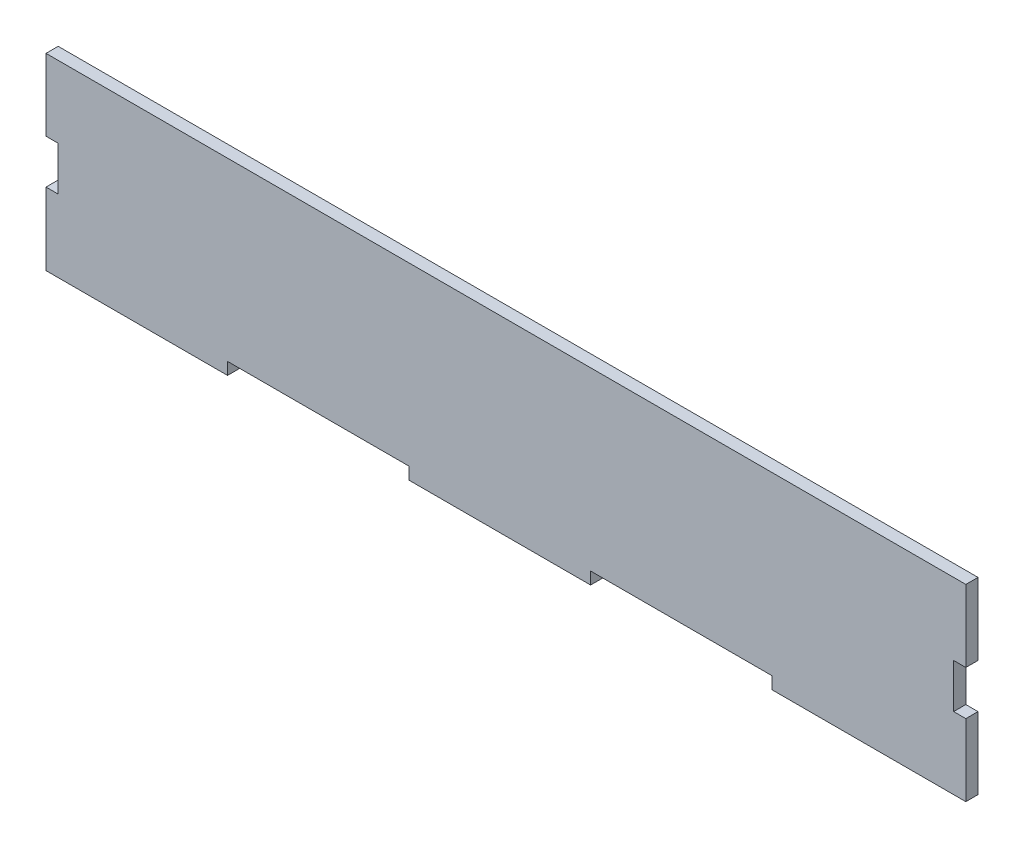
ISO-10303-21;
HEADER;
FILE_DESCRIPTION(('STEP AP214'),'2;1');
FILE_NAME('part.step','',(''),(''),'','','');
FILE_SCHEMA(('AUTOMOTIVE_DESIGN { 1 0 10303 214 1 1 1 1 }'));
ENDSEC;
DATA;
#1=APPLICATION_CONTEXT('core data for automotive mechanical design processes');
#2=APPLICATION_PROTOCOL_DEFINITION('international standard','automotive_design',2000,#1);
#3=PRODUCT_CONTEXT('',#1,'mechanical');
#4=PRODUCT('Part','Part','',(#3));
#5=PRODUCT_RELATED_PRODUCT_CATEGORY('part','',(#4));
#6=PRODUCT_DEFINITION_FORMATION('','',#4);
#7=PRODUCT_DEFINITION_CONTEXT('part definition',#1,'design');
#8=PRODUCT_DEFINITION('design','',#6,#7);
#9=PRODUCT_DEFINITION_SHAPE('','',#8);
#10=(LENGTH_UNIT() NAMED_UNIT(*) SI_UNIT(.MILLI.,.METRE.));
#11=(NAMED_UNIT(*) PLANE_ANGLE_UNIT() SI_UNIT($,.RADIAN.));
#12=(NAMED_UNIT(*) SI_UNIT($,.STERADIAN.) SOLID_ANGLE_UNIT());
#13=UNCERTAINTY_MEASURE_WITH_UNIT(LENGTH_MEASURE(1.E-05),#10,'distance_accuracy_value','');
#14=(GEOMETRIC_REPRESENTATION_CONTEXT(3) GLOBAL_UNCERTAINTY_ASSIGNED_CONTEXT((#13)) GLOBAL_UNIT_ASSIGNED_CONTEXT((#10,
#11,#12)) REPRESENTATION_CONTEXT('',''));
#15=CARTESIAN_POINT('',(0.,0.,0.));
#16=DIRECTION('',(0.,0.,1.));
#17=DIRECTION('',(1.,0.,0.));
#18=AXIS2_PLACEMENT_3D('',#15,#16,#17);
#19=CARTESIAN_POINT('',(-43.0339309113232,-18.4688509372373,5.5));
#20=DIRECTION('',(0.,-1.,0.));
#21=DIRECTION('',(0.,0.,-1.));
#22=AXIS2_PLACEMENT_3D('',#19,#20,#21);
#23=PLANE('',#22);
#24=DIRECTION('',(-1.,0.,0.));
#25=VECTOR('',#24,1.);
#26=CARTESIAN_POINT('',(-43.0339309113232,-18.4688509372373,0.));
#27=LINE('',#26,#25);
#28=CARTESIAN_POINT('',(-43.0339309113232,-18.4688509372373,0.));
#29=VERTEX_POINT('',#28);
#30=CARTESIAN_POINT('',(-48.5339309113232,-18.4688509372373,0.));
#31=VERTEX_POINT('',#30);
#32=EDGE_CURVE('E201',#29,#31,#27,.T.);
#33=ORIENTED_EDGE('',*,*,#32,.T.);
#34=DIRECTION('',(0.,0.,-1.));
#35=VECTOR('',#34,1.);
#36=CARTESIAN_POINT('',(-48.5339309113232,-18.4688509372373,5.5));
#37=LINE('',#36,#35);
#38=CARTESIAN_POINT('',(-48.5339309113232,-18.4688509372373,5.5));
#39=VERTEX_POINT('',#38);
#40=EDGE_CURVE('E11',#39,#31,#37,.T.);
#41=ORIENTED_EDGE('',*,*,#40,.F.);
#42=DIRECTION('',(-1.,0.,0.));
#43=VECTOR('',#42,1.);
#44=CARTESIAN_POINT('',(-43.0339309113232,-18.4688509372373,5.5));
#45=LINE('',#44,#43);
#46=CARTESIAN_POINT('',(-43.0339309113232,-18.4688509372373,5.5));
#47=VERTEX_POINT('',#46);
#48=EDGE_CURVE('E240',#47,#39,#45,.T.);
#49=ORIENTED_EDGE('',*,*,#48,.F.);
#50=DIRECTION('',(0.,0.,-1.));
#51=VECTOR('',#50,1.);
#52=CARTESIAN_POINT('',(-43.0339309113232,-18.4688509372373,5.5));
#53=LINE('',#52,#51);
#54=EDGE_CURVE('E197',#47,#29,#53,.T.);
#55=ORIENTED_EDGE('',*,*,#54,.T.);
#56=EDGE_LOOP('',(#33,#41,#49,#55));
#57=FACE_BOUND('',#56,.T.);
#58=ADVANCED_FACE('F33',(#57),#23,.F.);
#59=CARTESIAN_POINT('',(-48.5339309113232,-18.4688509372373,5.5));
#60=DIRECTION('',(1.,0.,0.));
#61=DIRECTION('',(0.,0.,-1.));
#62=AXIS2_PLACEMENT_3D('',#59,#60,#61);
#63=PLANE('',#62);
#64=DIRECTION('',(0.,-1.,0.));
#65=VECTOR('',#64,1.);
#66=CARTESIAN_POINT('',(-48.5339309113232,-18.4688509372373,0.));
#67=LINE('',#66,#65);
#68=CARTESIAN_POINT('',(-48.5339309113232,-51.1586437729942,0.));
#69=VERTEX_POINT('',#68);
#70=EDGE_CURVE('E204',#31,#69,#67,.T.);
#71=ORIENTED_EDGE('',*,*,#70,.T.);
#72=DIRECTION('',(0.,0.,-1.));
#73=VECTOR('',#72,1.);
#74=CARTESIAN_POINT('',(-48.5339309113232,-51.1586437729942,5.5));
#75=LINE('',#74,#73);
#76=CARTESIAN_POINT('',(-48.5339309113232,-51.1586437729942,5.5));
#77=VERTEX_POINT('',#76);
#78=EDGE_CURVE('E41',#77,#69,#75,.T.);
#79=ORIENTED_EDGE('',*,*,#78,.F.);
#80=DIRECTION('',(0.,-1.,0.));
#81=VECTOR('',#80,1.);
#82=CARTESIAN_POINT('',(-48.5339309113232,-18.4688509372373,5.5));
#83=LINE('',#82,#81);
#84=EDGE_CURVE('E128',#39,#77,#83,.T.);
#85=ORIENTED_EDGE('',*,*,#84,.F.);
#86=ORIENTED_EDGE('',*,*,#40,.T.);
#87=EDGE_LOOP('',(#71,#79,#85,#86));
#88=FACE_BOUND('',#87,.T.);
#89=ADVANCED_FACE('F358',(#88),#63,.F.);
#90=CARTESIAN_POINT('',(-48.5339309113232,-51.1586437729942,5.5));
#91=DIRECTION('',(0.,1.,0.));
#92=DIRECTION('',(0.,0.,1.));
#93=AXIS2_PLACEMENT_3D('',#90,#91,#92);
#94=PLANE('',#93);
#95=DIRECTION('',(1.,0.,0.));
#96=VECTOR('',#95,1.);
#97=CARTESIAN_POINT('',(-48.5339309113232,-51.1586437729942,0.));
#98=LINE('',#97,#96);
#99=CARTESIAN_POINT('',(33.4660690886768,-51.1586437729942,0.));
#100=VERTEX_POINT('',#99);
#101=EDGE_CURVE('E206',#69,#100,#98,.T.);
#102=ORIENTED_EDGE('',*,*,#101,.T.);
#103=DIRECTION('',(0.,0.,-1.));
#104=VECTOR('',#103,1.);
#105=CARTESIAN_POINT('',(33.4660690886768,-51.1586437729942,5.5));
#106=LINE('',#105,#104);
#107=CARTESIAN_POINT('',(33.4660690886768,-51.1586437729942,5.5));
#108=VERTEX_POINT('',#107);
#109=EDGE_CURVE('E283',#108,#100,#106,.T.);
#110=ORIENTED_EDGE('',*,*,#109,.F.);
#111=DIRECTION('',(1.,0.,0.));
#112=VECTOR('',#111,1.);
#113=CARTESIAN_POINT('',(-48.5339309113232,-51.1586437729942,5.5));
#114=LINE('',#113,#112);
#115=EDGE_CURVE('E291',#77,#108,#114,.T.);
#116=ORIENTED_EDGE('',*,*,#115,.F.);
#117=ORIENTED_EDGE('',*,*,#78,.T.);
#118=EDGE_LOOP('',(#102,#110,#116,#117));
#119=FACE_BOUND('',#118,.T.);
#120=ADVANCED_FACE('F289',(#119),#94,.F.);
#121=CARTESIAN_POINT('',(33.4660690886768,-51.1586437729942,5.5));
#122=DIRECTION('',(-1.,0.,0.));
#123=DIRECTION('',(0.,0.,1.));
#124=AXIS2_PLACEMENT_3D('',#121,#122,#123);
#125=PLANE('',#124);
#126=DIRECTION('',(0.,1.,0.));
#127=VECTOR('',#126,1.);
#128=CARTESIAN_POINT('',(33.4660690886768,-51.1586437729942,0.));
#129=LINE('',#128,#127);
#130=CARTESIAN_POINT('',(33.4660690886768,-45.6586437729942,0.));
#131=VERTEX_POINT('',#130);
#132=EDGE_CURVE('E208',#100,#131,#129,.T.);
#133=ORIENTED_EDGE('',*,*,#132,.T.);
#134=DIRECTION('',(0.,0.,-1.));
#135=VECTOR('',#134,1.);
#136=CARTESIAN_POINT('',(33.4660690886768,-45.6586437729942,5.5));
#137=LINE('',#136,#135);
#138=CARTESIAN_POINT('',(33.4660690886768,-45.6586437729942,5.5));
#139=VERTEX_POINT('',#138);
#140=EDGE_CURVE('E280',#139,#131,#137,.T.);
#141=ORIENTED_EDGE('',*,*,#140,.F.);
#142=DIRECTION('',(0.,1.,0.));
#143=VECTOR('',#142,1.);
#144=CARTESIAN_POINT('',(33.4660690886768,-51.1586437729942,5.5));
#145=LINE('',#144,#143);
#146=EDGE_CURVE('E309',#108,#139,#145,.T.);
#147=ORIENTED_EDGE('',*,*,#146,.F.);
#148=ORIENTED_EDGE('',*,*,#109,.T.);
#149=EDGE_LOOP('',(#133,#141,#147,#148));
#150=FACE_BOUND('',#149,.T.);
#151=ADVANCED_FACE('F300',(#150),#125,.F.);
#152=CARTESIAN_POINT('',(33.4660690886768,-45.6586437729942,5.5));
#153=DIRECTION('',(0.,1.,0.));
#154=DIRECTION('',(0.,0.,1.));
#155=AXIS2_PLACEMENT_3D('',#152,#153,#154);
#156=PLANE('',#155);
#157=DIRECTION('',(1.,0.,0.));
#158=VECTOR('',#157,1.);
#159=CARTESIAN_POINT('',(33.4660690886768,-45.6586437729942,0.));
#160=LINE('',#159,#158);
#161=CARTESIAN_POINT('',(115.466069088677,-45.6586437729942,0.));
#162=VERTEX_POINT('',#161);
#163=EDGE_CURVE('E210',#131,#162,#160,.T.);
#164=ORIENTED_EDGE('',*,*,#163,.T.);
#165=DIRECTION('',(0.,0.,-1.));
#166=VECTOR('',#165,1.);
#167=CARTESIAN_POINT('',(115.466069088677,-45.6586437729942,5.5));
#168=LINE('',#167,#166);
#169=CARTESIAN_POINT('',(115.466069088677,-45.6586437729942,5.5));
#170=VERTEX_POINT('',#169);
#171=EDGE_CURVE('E277',#170,#162,#168,.T.);
#172=ORIENTED_EDGE('',*,*,#171,.F.);
#173=DIRECTION('',(1.,0.,0.));
#174=VECTOR('',#173,1.);
#175=CARTESIAN_POINT('',(33.4660690886768,-45.6586437729942,5.5));
#176=LINE('',#175,#174);
#177=EDGE_CURVE('E306',#139,#170,#176,.T.);
#178=ORIENTED_EDGE('',*,*,#177,.F.);
#179=ORIENTED_EDGE('',*,*,#140,.T.);
#180=EDGE_LOOP('',(#164,#172,#178,#179));
#181=FACE_BOUND('',#180,.T.);
#182=ADVANCED_FACE('F304',(#181),#156,.F.);
#183=CARTESIAN_POINT('',(115.466069088677,-45.6586437729942,5.5));
#184=DIRECTION('',(1.,0.,0.));
#185=DIRECTION('',(0.,0.,-1.));
#186=AXIS2_PLACEMENT_3D('',#183,#184,#185);
#187=PLANE('',#186);
#188=DIRECTION('',(0.,-1.,0.));
#189=VECTOR('',#188,1.);
#190=CARTESIAN_POINT('',(115.466069088677,-45.6586437729942,0.));
#191=LINE('',#190,#189);
#192=CARTESIAN_POINT('',(115.466069088677,-51.1586437729942,0.));
#193=VERTEX_POINT('',#192);
#194=EDGE_CURVE('E212',#162,#193,#191,.T.);
#195=ORIENTED_EDGE('',*,*,#194,.T.);
#196=DIRECTION('',(0.,0.,-1.));
#197=VECTOR('',#196,1.);
#198=CARTESIAN_POINT('',(115.466069088677,-51.1586437729942,5.5));
#199=LINE('',#198,#197);
#200=CARTESIAN_POINT('',(115.466069088677,-51.1586437729942,5.5));
#201=VERTEX_POINT('',#200);
#202=EDGE_CURVE('E274',#201,#193,#199,.T.);
#203=ORIENTED_EDGE('',*,*,#202,.F.);
#204=DIRECTION('',(0.,-1.,0.));
#205=VECTOR('',#204,1.);
#206=CARTESIAN_POINT('',(115.466069088677,-45.6586437729942,5.5));
#207=LINE('',#206,#205);
#208=EDGE_CURVE('E308',#170,#201,#207,.T.);
#209=ORIENTED_EDGE('',*,*,#208,.F.);
#210=ORIENTED_EDGE('',*,*,#171,.T.);
#211=EDGE_LOOP('',(#195,#203,#209,#210));
#212=FACE_BOUND('',#211,.T.);
#213=ADVANCED_FACE('F371',(#212),#187,.F.);
#214=CARTESIAN_POINT('',(115.466069088677,-51.1586437729942,5.5));
#215=DIRECTION('',(0.,1.,0.));
#216=DIRECTION('',(0.,0.,1.));
#217=AXIS2_PLACEMENT_3D('',#214,#215,#216);
#218=PLANE('',#217);
#219=DIRECTION('',(1.,0.,0.));
#220=VECTOR('',#219,1.);
#221=CARTESIAN_POINT('',(115.466069088677,-51.1586437729942,0.));
#222=LINE('',#221,#220);
#223=CARTESIAN_POINT('',(197.466069088677,-51.1586437729942,0.));
#224=VERTEX_POINT('',#223);
#225=EDGE_CURVE('E214',#193,#224,#222,.T.);
#226=ORIENTED_EDGE('',*,*,#225,.T.);
#227=DIRECTION('',(0.,0.,-1.));
#228=VECTOR('',#227,1.);
#229=CARTESIAN_POINT('',(197.466069088677,-51.1586437729942,5.5));
#230=LINE('',#229,#228);
#231=CARTESIAN_POINT('',(197.466069088677,-51.1586437729942,5.5));
#232=VERTEX_POINT('',#231);
#233=EDGE_CURVE('E271',#232,#224,#230,.T.);
#234=ORIENTED_EDGE('',*,*,#233,.F.);
#235=DIRECTION('',(1.,0.,0.));
#236=VECTOR('',#235,1.);
#237=CARTESIAN_POINT('',(115.466069088677,-51.1586437729942,5.5));
#238=LINE('',#237,#236);
#239=EDGE_CURVE('E311',#201,#232,#238,.T.);
#240=ORIENTED_EDGE('',*,*,#239,.F.);
#241=ORIENTED_EDGE('',*,*,#202,.T.);
#242=EDGE_LOOP('',(#226,#234,#240,#241));
#243=FACE_BOUND('',#242,.T.);
#244=ADVANCED_FACE('F374',(#243),#218,.F.);
#245=CARTESIAN_POINT('',(197.466069088677,-51.1586437729942,5.5));
#246=DIRECTION('',(-1.,0.,0.));
#247=DIRECTION('',(0.,0.,1.));
#248=AXIS2_PLACEMENT_3D('',#245,#246,#247);
#249=PLANE('',#248);
#250=DIRECTION('',(0.,1.,0.));
#251=VECTOR('',#250,1.);
#252=CARTESIAN_POINT('',(197.466069088677,-51.1586437729942,0.));
#253=LINE('',#252,#251);
#254=CARTESIAN_POINT('',(197.466069088677,-45.6586437729942,0.));
#255=VERTEX_POINT('',#254);
#256=EDGE_CURVE('E216',#224,#255,#253,.T.);
#257=ORIENTED_EDGE('',*,*,#256,.T.);
#258=DIRECTION('',(0.,0.,-1.));
#259=VECTOR('',#258,1.);
#260=CARTESIAN_POINT('',(197.466069088677,-45.6586437729942,5.5));
#261=LINE('',#260,#259);
#262=CARTESIAN_POINT('',(197.466069088677,-45.6586437729942,5.5));
#263=VERTEX_POINT('',#262);
#264=EDGE_CURVE('E268',#263,#255,#261,.T.);
#265=ORIENTED_EDGE('',*,*,#264,.F.);
#266=DIRECTION('',(0.,1.,0.));
#267=VECTOR('',#266,1.);
#268=CARTESIAN_POINT('',(197.466069088677,-51.1586437729942,5.5));
#269=LINE('',#268,#267);
#270=EDGE_CURVE('E317',#232,#263,#269,.T.);
#271=ORIENTED_EDGE('',*,*,#270,.F.);
#272=ORIENTED_EDGE('',*,*,#233,.T.);
#273=EDGE_LOOP('',(#257,#265,#271,#272));
#274=FACE_BOUND('',#273,.T.);
#275=ADVANCED_FACE('F378',(#274),#249,.F.);
#276=CARTESIAN_POINT('',(197.466069088677,-45.6586437729942,5.5));
#277=DIRECTION('',(0.,1.,0.));
#278=DIRECTION('',(0.,0.,1.));
#279=AXIS2_PLACEMENT_3D('',#276,#277,#278);
#280=PLANE('',#279);
#281=DIRECTION('',(1.,0.,0.));
#282=VECTOR('',#281,1.);
#283=CARTESIAN_POINT('',(197.466069088677,-45.6586437729942,0.));
#284=LINE('',#283,#282);
#285=CARTESIAN_POINT('',(279.466069088677,-45.6586437729942,0.));
#286=VERTEX_POINT('',#285);
#287=EDGE_CURVE('E218',#255,#286,#284,.T.);
#288=ORIENTED_EDGE('',*,*,#287,.T.);
#289=DIRECTION('',(0.,0.,-1.));
#290=VECTOR('',#289,1.);
#291=CARTESIAN_POINT('',(279.466069088677,-45.6586437729942,5.5));
#292=LINE('',#291,#290);
#293=CARTESIAN_POINT('',(279.466069088677,-45.6586437729942,5.5));
#294=VERTEX_POINT('',#293);
#295=EDGE_CURVE('E265',#294,#286,#292,.T.);
#296=ORIENTED_EDGE('',*,*,#295,.F.);
#297=DIRECTION('',(1.,0.,0.));
#298=VECTOR('',#297,1.);
#299=CARTESIAN_POINT('',(197.466069088677,-45.6586437729942,5.5));
#300=LINE('',#299,#298);
#301=EDGE_CURVE('E319',#263,#294,#300,.T.);
#302=ORIENTED_EDGE('',*,*,#301,.F.);
#303=ORIENTED_EDGE('',*,*,#264,.T.);
#304=EDGE_LOOP('',(#288,#296,#302,#303));
#305=FACE_BOUND('',#304,.T.);
#306=ADVANCED_FACE('F382',(#305),#280,.F.);
#307=CARTESIAN_POINT('',(279.466069088677,-45.6586437729942,5.5));
#308=DIRECTION('',(1.,0.,0.));
#309=DIRECTION('',(0.,0.,-1.));
#310=AXIS2_PLACEMENT_3D('',#307,#308,#309);
#311=PLANE('',#310);
#312=DIRECTION('',(0.,-1.,0.));
#313=VECTOR('',#312,1.);
#314=CARTESIAN_POINT('',(279.466069088677,-45.6586437729942,0.));
#315=LINE('',#314,#313);
#316=CARTESIAN_POINT('',(279.466069088677,-51.1586437729942,0.));
#317=VERTEX_POINT('',#316);
#318=EDGE_CURVE('E220',#286,#317,#315,.T.);
#319=ORIENTED_EDGE('',*,*,#318,.T.);
#320=DIRECTION('',(0.,0.,-1.));
#321=VECTOR('',#320,1.);
#322=CARTESIAN_POINT('',(279.466069088677,-51.1586437729942,5.5));
#323=LINE('',#322,#321);
#324=CARTESIAN_POINT('',(279.466069088677,-51.1586437729942,5.5));
#325=VERTEX_POINT('',#324);
#326=EDGE_CURVE('E262',#325,#317,#323,.T.);
#327=ORIENTED_EDGE('',*,*,#326,.F.);
#328=DIRECTION('',(0.,-1.,0.));
#329=VECTOR('',#328,1.);
#330=CARTESIAN_POINT('',(279.466069088677,-45.6586437729942,5.5));
#331=LINE('',#330,#329);
#332=EDGE_CURVE('E321',#294,#325,#331,.T.);
#333=ORIENTED_EDGE('',*,*,#332,.F.);
#334=ORIENTED_EDGE('',*,*,#295,.T.);
#335=EDGE_LOOP('',(#319,#327,#333,#334));
#336=FACE_BOUND('',#335,.T.);
#337=ADVANCED_FACE('F386',(#336),#311,.F.);
#338=CARTESIAN_POINT('',(279.466069088677,-51.1586437729942,5.5));
#339=DIRECTION('',(0.,1.,0.));
#340=DIRECTION('',(0.,0.,1.));
#341=AXIS2_PLACEMENT_3D('',#338,#339,#340);
#342=PLANE('',#341);
#343=DIRECTION('',(1.,0.,0.));
#344=VECTOR('',#343,1.);
#345=CARTESIAN_POINT('',(279.466069088677,-51.1586437729942,0.));
#346=LINE('',#345,#344);
#347=CARTESIAN_POINT('',(366.966069088677,-51.1586437729942,0.));
#348=VERTEX_POINT('',#347);
#349=EDGE_CURVE('E222',#317,#348,#346,.T.);
#350=ORIENTED_EDGE('',*,*,#349,.T.);
#351=DIRECTION('',(0.,0.,-1.));
#352=VECTOR('',#351,1.);
#353=CARTESIAN_POINT('',(366.966069088677,-51.1586437729942,5.5));
#354=LINE('',#353,#352);
#355=CARTESIAN_POINT('',(366.966069088677,-51.1586437729942,5.5));
#356=VERTEX_POINT('',#355);
#357=EDGE_CURVE('E259',#356,#348,#354,.T.);
#358=ORIENTED_EDGE('',*,*,#357,.F.);
#359=DIRECTION('',(1.,0.,0.));
#360=VECTOR('',#359,1.);
#361=CARTESIAN_POINT('',(279.466069088677,-51.1586437729942,5.5));
#362=LINE('',#361,#360);
#363=EDGE_CURVE('E323',#325,#356,#362,.T.);
#364=ORIENTED_EDGE('',*,*,#363,.F.);
#365=ORIENTED_EDGE('',*,*,#326,.T.);
#366=EDGE_LOOP('',(#350,#358,#364,#365));
#367=FACE_BOUND('',#366,.T.);
#368=ADVANCED_FACE('F390',(#367),#342,.F.);
#369=CARTESIAN_POINT('',(366.966069088677,-18.6586437729942,5.5));
#370=DIRECTION('',(-1.,0.,0.));
#371=DIRECTION('',(0.,0.,1.));
#372=AXIS2_PLACEMENT_3D('',#369,#370,#371);
#373=PLANE('',#372);
#374=DIRECTION('',(0.,1.,0.));
#375=VECTOR('',#374,1.);
#376=CARTESIAN_POINT('',(366.966069088677,-18.6586437729942,0.));
#377=LINE('',#376,#375);
#378=CARTESIAN_POINT('',(366.966069088677,-18.6586437729942,0.));
#379=VERTEX_POINT('',#378);
#380=EDGE_CURVE('E224',#348,#379,#377,.T.);
#381=ORIENTED_EDGE('',*,*,#380,.T.);
#382=DIRECTION('',(0.,0.,-1.));
#383=VECTOR('',#382,1.);
#384=CARTESIAN_POINT('',(366.966069088677,-18.6586437729942,5.5));
#385=LINE('',#384,#383);
#386=CARTESIAN_POINT('',(366.966069088677,-18.6586437729942,5.5));
#387=VERTEX_POINT('',#386);
#388=EDGE_CURVE('E256',#387,#379,#385,.T.);
#389=ORIENTED_EDGE('',*,*,#388,.F.);
#390=DIRECTION('',(0.,1.,0.));
#391=VECTOR('',#390,1.);
#392=CARTESIAN_POINT('',(366.966069088677,-18.6586437729942,5.5));
#393=LINE('',#392,#391);
#394=EDGE_CURVE('E325',#356,#387,#393,.T.);
#395=ORIENTED_EDGE('',*,*,#394,.F.);
#396=ORIENTED_EDGE('',*,*,#357,.T.);
#397=EDGE_LOOP('',(#381,#389,#395,#396));
#398=FACE_BOUND('',#397,.T.);
#399=ADVANCED_FACE('F394',(#398),#373,.F.);
#400=CARTESIAN_POINT('',(366.966069088677,-18.6586437729942,5.5));
#401=DIRECTION('',(0.,-1.,0.));
#402=DIRECTION('',(1.,0.,0.));
#403=AXIS2_PLACEMENT_3D('',#400,#401,#402);
#404=PLANE('',#403);
#405=DIRECTION('',(-1.,0.,0.));
#406=VECTOR('',#405,1.);
#407=CARTESIAN_POINT('',(366.966069088677,-18.6586437729942,0.));
#408=LINE('',#407,#406);
#409=CARTESIAN_POINT('',(361.466069088677,-18.6586437729942,0.));
#410=VERTEX_POINT('',#409);
#411=EDGE_CURVE('E226',#379,#410,#408,.T.);
#412=ORIENTED_EDGE('',*,*,#411,.T.);
#413=DIRECTION('',(0.,0.,-1.));
#414=VECTOR('',#413,1.);
#415=CARTESIAN_POINT('',(361.466069088677,-18.6586437729942,5.5));
#416=LINE('',#415,#414);
#417=CARTESIAN_POINT('',(361.466069088677,-18.6586437729942,5.5));
#418=VERTEX_POINT('',#417);
#419=EDGE_CURVE('E253',#418,#410,#416,.T.);
#420=ORIENTED_EDGE('',*,*,#419,.F.);
#421=DIRECTION('',(-1.,0.,0.));
#422=VECTOR('',#421,1.);
#423=CARTESIAN_POINT('',(366.966069088677,-18.6586437729942,5.5));
#424=LINE('',#423,#422);
#425=EDGE_CURVE('E327',#387,#418,#424,.T.);
#426=ORIENTED_EDGE('',*,*,#425,.F.);
#427=ORIENTED_EDGE('',*,*,#388,.T.);
#428=EDGE_LOOP('',(#412,#420,#426,#427));
#429=FACE_BOUND('',#428,.T.);
#430=ADVANCED_FACE('F398',(#429),#404,.F.);
#431=CARTESIAN_POINT('',(361.466069088677,-8.65864377299418,5.5));
#432=DIRECTION('',(-1.,0.,0.));
#433=DIRECTION('',(0.,0.,1.));
#434=AXIS2_PLACEMENT_3D('',#431,#432,#433);
#435=PLANE('',#434);
#436=DIRECTION('',(0.,1.,0.));
#437=VECTOR('',#436,1.);
#438=CARTESIAN_POINT('',(361.466069088677,-8.65864377299418,0.));
#439=LINE('',#438,#437);
#440=CARTESIAN_POINT('',(361.466069088677,1.34135622700582,0.));
#441=VERTEX_POINT('',#440);
#442=EDGE_CURVE('E229',#410,#441,#439,.T.);
#443=ORIENTED_EDGE('',*,*,#442,.T.);
#444=DIRECTION('',(0.,0.,-1.));
#445=VECTOR('',#444,1.);
#446=CARTESIAN_POINT('',(361.466069088677,1.34135622700582,5.5));
#447=LINE('',#446,#445);
#448=CARTESIAN_POINT('',(361.466069088677,1.34135622700582,5.5));
#449=VERTEX_POINT('',#448);
#450=EDGE_CURVE('E250',#449,#441,#447,.T.);
#451=ORIENTED_EDGE('',*,*,#450,.F.);
#452=DIRECTION('',(0.,1.,0.));
#453=VECTOR('',#452,1.);
#454=CARTESIAN_POINT('',(361.466069088677,-18.6586437729942,5.5));
#455=LINE('',#454,#453);
#456=EDGE_CURVE('E329',#418,#449,#455,.T.);
#457=ORIENTED_EDGE('',*,*,#456,.F.);
#458=ORIENTED_EDGE('',*,*,#419,.T.);
#459=EDGE_LOOP('',(#443,#451,#457,#458));
#460=FACE_BOUND('',#459,.T.);
#461=ADVANCED_FACE('F402',(#460),#435,.F.);
#462=CARTESIAN_POINT('',(361.466069088677,1.34135622700582,5.5));
#463=DIRECTION('',(0.,1.,0.));
#464=DIRECTION('',(0.,0.,1.));
#465=AXIS2_PLACEMENT_3D('',#462,#463,#464);
#466=PLANE('',#465);
#467=DIRECTION('',(1.,0.,0.));
#468=VECTOR('',#467,1.);
#469=CARTESIAN_POINT('',(361.466069088677,1.34135622700582,0.));
#470=LINE('',#469,#468);
#471=CARTESIAN_POINT('',(366.966069088677,1.34135622700582,0.));
#472=VERTEX_POINT('',#471);
#473=EDGE_CURVE('E231',#441,#472,#470,.T.);
#474=ORIENTED_EDGE('',*,*,#473,.T.);
#475=DIRECTION('',(0.,0.,-1.));
#476=VECTOR('',#475,1.);
#477=CARTESIAN_POINT('',(366.966069088677,1.34135622700582,5.5));
#478=LINE('',#477,#476);
#479=CARTESIAN_POINT('',(366.966069088677,1.34135622700582,5.5));
#480=VERTEX_POINT('',#479);
#481=EDGE_CURVE('E247',#480,#472,#478,.T.);
#482=ORIENTED_EDGE('',*,*,#481,.F.);
#483=DIRECTION('',(1.,0.,0.));
#484=VECTOR('',#483,1.);
#485=CARTESIAN_POINT('',(361.466069088677,1.34135622700582,5.5));
#486=LINE('',#485,#484);
#487=EDGE_CURVE('E331',#449,#480,#486,.T.);
#488=ORIENTED_EDGE('',*,*,#487,.F.);
#489=ORIENTED_EDGE('',*,*,#450,.T.);
#490=EDGE_LOOP('',(#474,#482,#488,#489));
#491=FACE_BOUND('',#490,.T.);
#492=ADVANCED_FACE('F406',(#491),#466,.F.);
#493=CARTESIAN_POINT('',(366.966069088677,33.8413562270058,5.5));
#494=DIRECTION('',(-1.,0.,0.));
#495=DIRECTION('',(0.,0.,1.));
#496=AXIS2_PLACEMENT_3D('',#493,#494,#495);
#497=PLANE('',#496);
#498=DIRECTION('',(0.,1.,0.));
#499=VECTOR('',#498,1.);
#500=CARTESIAN_POINT('',(366.966069088677,33.8413562270058,0.));
#501=LINE('',#500,#499);
#502=CARTESIAN_POINT('',(366.966069088677,33.8413562270058,0.));
#503=VERTEX_POINT('',#502);
#504=EDGE_CURVE('E233',#472,#503,#501,.T.);
#505=ORIENTED_EDGE('',*,*,#504,.T.);
#506=DIRECTION('',(0.,0.,-1.));
#507=VECTOR('',#506,1.);
#508=CARTESIAN_POINT('',(366.966069088677,33.8413562270058,5.5));
#509=LINE('',#508,#507);
#510=CARTESIAN_POINT('',(366.966069088677,33.8413562270058,5.5));
#511=VERTEX_POINT('',#510);
#512=EDGE_CURVE('E244',#511,#503,#509,.T.);
#513=ORIENTED_EDGE('',*,*,#512,.F.);
#514=DIRECTION('',(0.,1.,0.));
#515=VECTOR('',#514,1.);
#516=CARTESIAN_POINT('',(366.966069088677,33.8413562270058,5.5));
#517=LINE('',#516,#515);
#518=EDGE_CURVE('E333',#480,#511,#517,.T.);
#519=ORIENTED_EDGE('',*,*,#518,.F.);
#520=ORIENTED_EDGE('',*,*,#481,.T.);
#521=EDGE_LOOP('',(#505,#513,#519,#520));
#522=FACE_BOUND('',#521,.T.);
#523=ADVANCED_FACE('F339',(#522),#497,.F.);
#524=CARTESIAN_POINT('',(-48.5339309113232,33.8413562270058,5.5));
#525=DIRECTION('',(0.,-1.,0.));
#526=DIRECTION('',(0.,0.,-1.));
#527=AXIS2_PLACEMENT_3D('',#524,#525,#526);
#528=PLANE('',#527);
#529=DIRECTION('',(-1.,0.,0.));
#530=VECTOR('',#529,1.);
#531=CARTESIAN_POINT('',(-48.5339309113232,33.8413562270058,0.));
#532=LINE('',#531,#530);
#533=CARTESIAN_POINT('',(-48.5339309113232,33.8413562270058,0.));
#534=VERTEX_POINT('',#533);
#535=EDGE_CURVE('E235',#503,#534,#532,.T.);
#536=ORIENTED_EDGE('',*,*,#535,.T.);
#537=DIRECTION('',(0.,0.,-1.));
#538=VECTOR('',#537,1.);
#539=CARTESIAN_POINT('',(-48.5339309113232,33.8413562270058,5.5));
#540=LINE('',#539,#538);
#541=CARTESIAN_POINT('',(-48.5339309113232,33.8413562270058,5.5));
#542=VERTEX_POINT('',#541);
#543=EDGE_CURVE('E192',#542,#534,#540,.T.);
#544=ORIENTED_EDGE('',*,*,#543,.F.);
#545=DIRECTION('',(-1.,0.,0.));
#546=VECTOR('',#545,1.);
#547=CARTESIAN_POINT('',(-48.5339309113232,33.8413562270058,5.5));
#548=LINE('',#547,#546);
#549=EDGE_CURVE('E183',#511,#542,#548,.T.);
#550=ORIENTED_EDGE('',*,*,#549,.F.);
#551=ORIENTED_EDGE('',*,*,#512,.T.);
#552=EDGE_LOOP('',(#536,#544,#550,#551));
#553=FACE_BOUND('',#552,.T.);
#554=ADVANCED_FACE('F343',(#553),#528,.F.);
#555=CARTESIAN_POINT('',(-48.5339309113232,1.42047220165704,5.5));
#556=DIRECTION('',(1.,0.,0.));
#557=DIRECTION('',(0.,0.,-1.));
#558=AXIS2_PLACEMENT_3D('',#555,#556,#557);
#559=PLANE('',#558);
#560=DIRECTION('',(0.,-1.,0.));
#561=VECTOR('',#560,1.);
#562=CARTESIAN_POINT('',(-48.5339309113232,1.42047220165704,0.));
#563=LINE('',#562,#561);
#564=CARTESIAN_POINT('',(-48.5339309113232,1.42047220165704,0.));
#565=VERTEX_POINT('',#564);
#566=EDGE_CURVE('E191',#534,#565,#563,.T.);
#567=ORIENTED_EDGE('',*,*,#566,.T.);
#568=DIRECTION('',(0.,0.,-1.));
#569=VECTOR('',#568,1.);
#570=CARTESIAN_POINT('',(-48.5339309113232,1.42047220165704,5.5));
#571=LINE('',#570,#569);
#572=CARTESIAN_POINT('',(-48.5339309113232,1.42047220165704,5.5));
#573=VERTEX_POINT('',#572);
#574=EDGE_CURVE('E188',#573,#565,#571,.T.);
#575=ORIENTED_EDGE('',*,*,#574,.F.);
#576=DIRECTION('',(0.,-1.,0.));
#577=VECTOR('',#576,1.);
#578=CARTESIAN_POINT('',(-48.5339309113232,1.42047220165704,5.5));
#579=LINE('',#578,#577);
#580=EDGE_CURVE('E177',#542,#573,#579,.T.);
#581=ORIENTED_EDGE('',*,*,#580,.F.);
#582=ORIENTED_EDGE('',*,*,#543,.T.);
#583=EDGE_LOOP('',(#567,#575,#581,#582));
#584=FACE_BOUND('',#583,.T.);
#585=ADVANCED_FACE('F189',(#584),#559,.F.);
#586=CARTESIAN_POINT('',(-48.5339309113232,1.42047220165704,5.5));
#587=DIRECTION('',(0.,1.,0.));
#588=DIRECTION('',(0.,0.,1.));
#589=AXIS2_PLACEMENT_3D('',#586,#587,#588);
#590=PLANE('',#589);
#591=DIRECTION('',(1.,0.,0.));
#592=VECTOR('',#591,1.);
#593=CARTESIAN_POINT('',(-48.5339309113232,1.42047220165704,0.));
#594=LINE('',#593,#592);
#595=CARTESIAN_POINT('',(-43.0339309113232,1.42047220165704,0.));
#596=VERTEX_POINT('',#595);
#597=EDGE_CURVE('E114',#565,#596,#594,.T.);
#598=ORIENTED_EDGE('',*,*,#597,.T.);
#599=DIRECTION('',(0.,0.,-1.));
#600=VECTOR('',#599,1.);
#601=CARTESIAN_POINT('',(-43.0339309113232,1.42047220165704,5.5));
#602=LINE('',#601,#600);
#603=CARTESIAN_POINT('',(-43.0339309113232,1.42047220165704,5.5));
#604=VERTEX_POINT('',#603);
#605=EDGE_CURVE('E193',#604,#596,#602,.T.);
#606=ORIENTED_EDGE('',*,*,#605,.F.);
#607=DIRECTION('',(1.,0.,0.));
#608=VECTOR('',#607,1.);
#609=CARTESIAN_POINT('',(-48.5339309113232,1.42047220165704,5.5));
#610=LINE('',#609,#608);
#611=EDGE_CURVE('E181',#573,#604,#610,.T.);
#612=ORIENTED_EDGE('',*,*,#611,.F.);
#613=ORIENTED_EDGE('',*,*,#574,.T.);
#614=EDGE_LOOP('',(#598,#606,#612,#613));
#615=FACE_BOUND('',#614,.T.);
#616=ADVANCED_FACE('F195',(#615),#590,.F.);
#617=CARTESIAN_POINT('',(-43.0339309113232,1.42047220165704,5.5));
#618=DIRECTION('',(1.,0.,0.));
#619=DIRECTION('',(0.,0.,-1.));
#620=AXIS2_PLACEMENT_3D('',#617,#618,#619);
#621=PLANE('',#620);
#622=DIRECTION('',(0.,-1.,0.));
#623=VECTOR('',#622,1.);
#624=CARTESIAN_POINT('',(-43.0339309113232,1.42047220165704,0.));
#625=LINE('',#624,#623);
#626=EDGE_CURVE('E120',#596,#29,#625,.T.);
#627=ORIENTED_EDGE('',*,*,#626,.T.);
#628=ORIENTED_EDGE('',*,*,#54,.F.);
#629=DIRECTION('',(0.,-1.,0.));
#630=VECTOR('',#629,1.);
#631=CARTESIAN_POINT('',(-43.0339309113232,1.42047220165704,5.5));
#632=LINE('',#631,#630);
#633=EDGE_CURVE('E49',#604,#47,#632,.T.);
#634=ORIENTED_EDGE('',*,*,#633,.F.);
#635=ORIENTED_EDGE('',*,*,#605,.T.);
#636=EDGE_LOOP('',(#627,#628,#634,#635));
#637=FACE_BOUND('',#636,.T.);
#638=ADVANCED_FACE('F347',(#637),#621,.F.);
#639=CARTESIAN_POINT('',(0.,0.,5.5));
#640=DIRECTION('',(0.,0.,1.));
#641=DIRECTION('',(1.,0.,0.));
#642=AXIS2_PLACEMENT_3D('',#639,#640,#641);
#643=PLANE('',#642);
#644=ORIENTED_EDGE('',*,*,#48,.T.);
#645=ORIENTED_EDGE('',*,*,#84,.T.);
#646=ORIENTED_EDGE('',*,*,#115,.T.);
#647=ORIENTED_EDGE('',*,*,#146,.T.);
#648=ORIENTED_EDGE('',*,*,#177,.T.);
#649=ORIENTED_EDGE('',*,*,#208,.T.);
#650=ORIENTED_EDGE('',*,*,#239,.T.);
#651=ORIENTED_EDGE('',*,*,#270,.T.);
#652=ORIENTED_EDGE('',*,*,#301,.T.);
#653=ORIENTED_EDGE('',*,*,#332,.T.);
#654=ORIENTED_EDGE('',*,*,#363,.T.);
#655=ORIENTED_EDGE('',*,*,#394,.T.);
#656=ORIENTED_EDGE('',*,*,#425,.T.);
#657=ORIENTED_EDGE('',*,*,#456,.T.);
#658=ORIENTED_EDGE('',*,*,#487,.T.);
#659=ORIENTED_EDGE('',*,*,#518,.T.);
#660=ORIENTED_EDGE('',*,*,#549,.T.);
#661=ORIENTED_EDGE('',*,*,#580,.T.);
#662=ORIENTED_EDGE('',*,*,#611,.T.);
#663=ORIENTED_EDGE('',*,*,#633,.T.);
#664=EDGE_LOOP('',(#644,#645,#646,#647,#648,#649,#650,#651,#652,#653,#654,#655,#656,#657,#658,
#659,#660,#661,#662,#663));
#665=FACE_BOUND('',#664,.T.);
#666=ADVANCED_FACE('F179',(#665),#643,.T.);
#667=CARTESIAN_POINT('',(0.,0.,0.));
#668=DIRECTION('',(0.,0.,1.));
#669=DIRECTION('',(1.,0.,0.));
#670=AXIS2_PLACEMENT_3D('',#667,#668,#669);
#671=PLANE('',#670);
#672=ORIENTED_EDGE('',*,*,#32,.F.);
#673=ORIENTED_EDGE('',*,*,#626,.F.);
#674=ORIENTED_EDGE('',*,*,#597,.F.);
#675=ORIENTED_EDGE('',*,*,#566,.F.);
#676=ORIENTED_EDGE('',*,*,#535,.F.);
#677=ORIENTED_EDGE('',*,*,#504,.F.);
#678=ORIENTED_EDGE('',*,*,#473,.F.);
#679=ORIENTED_EDGE('',*,*,#442,.F.);
#680=ORIENTED_EDGE('',*,*,#411,.F.);
#681=ORIENTED_EDGE('',*,*,#380,.F.);
#682=ORIENTED_EDGE('',*,*,#349,.F.);
#683=ORIENTED_EDGE('',*,*,#318,.F.);
#684=ORIENTED_EDGE('',*,*,#287,.F.);
#685=ORIENTED_EDGE('',*,*,#256,.F.);
#686=ORIENTED_EDGE('',*,*,#225,.F.);
#687=ORIENTED_EDGE('',*,*,#194,.F.);
#688=ORIENTED_EDGE('',*,*,#163,.F.);
#689=ORIENTED_EDGE('',*,*,#132,.F.);
#690=ORIENTED_EDGE('',*,*,#101,.F.);
#691=ORIENTED_EDGE('',*,*,#70,.F.);
#692=EDGE_LOOP('',(#672,#673,#674,#675,#676,#677,#678,#679,#680,#681,#682,#683,#684,#685,#686,
#687,#688,#689,#690,#691));
#693=FACE_BOUND('',#692,.T.);
#694=ADVANCED_FACE('F295',(#693),#671,.F.);
#695=CLOSED_SHELL('',(#58,#89,#120,#151,#182,#213,#244,#275,#306,#337,#368,#399,#430,#461,#492,
#523,#554,#585,#616,#638,#666,#694));
#696=MANIFOLD_SOLID_BREP('B2',#695);
#697=ADVANCED_BREP_SHAPE_REPRESENTATION('',(#18,#696),#14);
#698=SHAPE_DEFINITION_REPRESENTATION(#9,#697);
ENDSEC;
END-ISO-10303-21;
